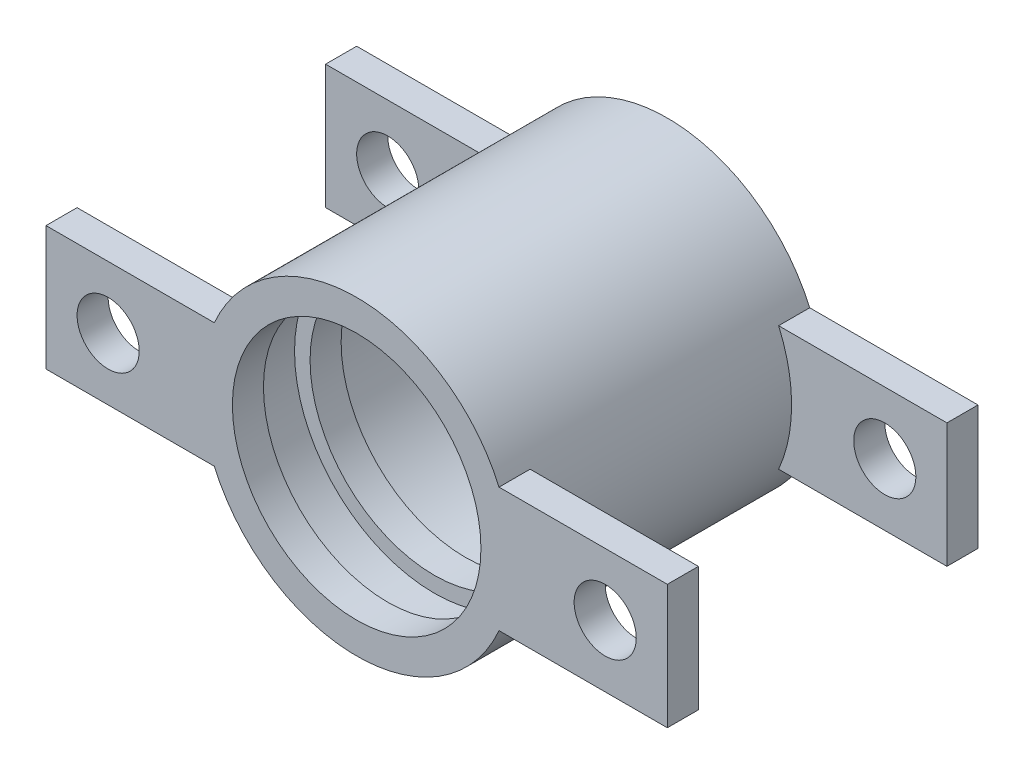
ISO-10303-21;
HEADER;
FILE_DESCRIPTION(('STEP AP214'),'2;1');
FILE_NAME('part.step','',(''),(''),'','','');
FILE_SCHEMA(('AUTOMOTIVE_DESIGN { 1 0 10303 214 1 1 1 1 }'));
ENDSEC;
DATA;
#1=APPLICATION_CONTEXT('core data for automotive mechanical design processes');
#2=APPLICATION_PROTOCOL_DEFINITION('international standard','automotive_design',2000,#1);
#3=PRODUCT_CONTEXT('',#1,'mechanical');
#4=PRODUCT('Part','Part','',(#3));
#5=PRODUCT_RELATED_PRODUCT_CATEGORY('part','',(#4));
#6=PRODUCT_DEFINITION_FORMATION('','',#4);
#7=PRODUCT_DEFINITION_CONTEXT('part definition',#1,'design');
#8=PRODUCT_DEFINITION('design','',#6,#7);
#9=PRODUCT_DEFINITION_SHAPE('','',#8);
#10=(LENGTH_UNIT() NAMED_UNIT(*) SI_UNIT(.MILLI.,.METRE.));
#11=(NAMED_UNIT(*) PLANE_ANGLE_UNIT() SI_UNIT($,.RADIAN.));
#12=(NAMED_UNIT(*) SI_UNIT($,.STERADIAN.) SOLID_ANGLE_UNIT());
#13=UNCERTAINTY_MEASURE_WITH_UNIT(LENGTH_MEASURE(1.E-05),#10,'distance_accuracy_value','');
#14=(GEOMETRIC_REPRESENTATION_CONTEXT(3) GLOBAL_UNCERTAINTY_ASSIGNED_CONTEXT((#13)) GLOBAL_UNIT_ASSIGNED_CONTEXT((#10,
#11,#12)) REPRESENTATION_CONTEXT('',''));
#15=CARTESIAN_POINT('',(0.,0.,0.));
#16=DIRECTION('',(0.,0.,1.));
#17=DIRECTION('',(1.,0.,0.));
#18=AXIS2_PLACEMENT_3D('',#15,#16,#17);
#19=CARTESIAN_POINT('',(0.,0.,-100.912408759124));
#20=DIRECTION('',(0.,0.,-1.));
#21=DIRECTION('',(-1.,0.,0.));
#22=AXIS2_PLACEMENT_3D('',#19,#20,#21);
#23=CYLINDRICAL_SURFACE('',#22,50.);
#24=DIRECTION('',(0.,0.,1.));
#25=VECTOR('',#24,1.);
#26=CARTESIAN_POINT('',(-45.8257569495584,20.,40.));
#27=LINE('',#26,#25);
#28=CARTESIAN_POINT('',(-45.8257569495584,20.,40.));
#29=VERTEX_POINT('',#28);
#30=CARTESIAN_POINT('',(-45.8257569495584,20.,50.));
#31=VERTEX_POINT('',#30);
#32=EDGE_CURVE('E269',#29,#31,#27,.T.);
#33=ORIENTED_EDGE('',*,*,#32,.T.);
#34=CARTESIAN_POINT('',(0.,0.,50.));
#35=DIRECTION('',(0.,0.,-1.));
#36=DIRECTION('',(-1.,0.,0.));
#37=AXIS2_PLACEMENT_3D('',#34,#35,#36);
#38=CIRCLE('',#37,50.);
#39=CARTESIAN_POINT('',(45.8257569495584,20.,50.));
#40=VERTEX_POINT('',#39);
#41=EDGE_CURVE('E386',#31,#40,#38,.T.);
#42=ORIENTED_EDGE('',*,*,#41,.T.);
#43=DIRECTION('',(0.,0.,1.));
#44=VECTOR('',#43,1.);
#45=CARTESIAN_POINT('',(45.8257569495584,20.,40.));
#46=LINE('',#45,#44);
#47=CARTESIAN_POINT('',(45.8257569495584,20.,40.));
#48=VERTEX_POINT('',#47);
#49=EDGE_CURVE('E326',#48,#40,#46,.T.);
#50=ORIENTED_EDGE('',*,*,#49,.F.);
#51=CARTESIAN_POINT('',(0.,0.,40.));
#52=DIRECTION('',(0.,0.,-1.));
#53=DIRECTION('',(1.,0.,0.));
#54=AXIS2_PLACEMENT_3D('',#51,#52,#53);
#55=CIRCLE('',#54,50.);
#56=CARTESIAN_POINT('',(45.8257569495584,-20.,40.));
#57=VERTEX_POINT('',#56);
#58=EDGE_CURVE('E300',#48,#57,#55,.T.);
#59=ORIENTED_EDGE('',*,*,#58,.T.);
#60=DIRECTION('',(0.,0.,1.));
#61=VECTOR('',#60,1.);
#62=CARTESIAN_POINT('',(45.8257569495584,-20.,40.));
#63=LINE('',#62,#61);
#64=CARTESIAN_POINT('',(45.8257569495584,-20.,50.));
#65=VERTEX_POINT('',#64);
#66=EDGE_CURVE('E322',#57,#65,#63,.T.);
#67=ORIENTED_EDGE('',*,*,#66,.T.);
#68=CARTESIAN_POINT('',(-45.8257569495584,-20.,50.));
#69=VERTEX_POINT('',#68);
#70=EDGE_CURVE('E387',#65,#69,#38,.T.);
#71=ORIENTED_EDGE('',*,*,#70,.T.);
#72=DIRECTION('',(0.,0.,1.));
#73=VECTOR('',#72,1.);
#74=CARTESIAN_POINT('',(-45.8257569495584,-20.,40.));
#75=LINE('',#74,#73);
#76=CARTESIAN_POINT('',(-45.8257569495584,-20.,40.));
#77=VERTEX_POINT('',#76);
#78=EDGE_CURVE('E274',#77,#69,#75,.T.);
#79=ORIENTED_EDGE('',*,*,#78,.F.);
#80=CARTESIAN_POINT('',(0.,0.,40.));
#81=DIRECTION('',(0.,0.,-1.));
#82=DIRECTION('',(1.,0.,0.));
#83=AXIS2_PLACEMENT_3D('',#80,#81,#82);
#84=CIRCLE('',#83,50.);
#85=EDGE_CURVE('E255',#77,#29,#84,.T.);
#86=ORIENTED_EDGE('',*,*,#85,.T.);
#87=EDGE_LOOP('',(#33,#42,#50,#59,#67,#71,#79,#86));
#88=FACE_BOUND('',#87,.T.);
#89=CARTESIAN_POINT('',(0.,0.,-50.));
#90=DIRECTION('',(0.,0.,-1.));
#91=DIRECTION('',(-1.,0.,0.));
#92=AXIS2_PLACEMENT_3D('',#89,#90,#91);
#93=CIRCLE('',#92,50.);
#94=CARTESIAN_POINT('',(-45.8257569495584,20.,-50.));
#95=VERTEX_POINT('',#94);
#96=CARTESIAN_POINT('',(45.8257569495584,20.,-50.));
#97=VERTEX_POINT('',#96);
#98=EDGE_CURVE('E49',#95,#97,#93,.T.);
#99=ORIENTED_EDGE('',*,*,#98,.F.);
#100=DIRECTION('',(0.,0.,-1.));
#101=VECTOR('',#100,1.);
#102=CARTESIAN_POINT('',(-45.8257569495584,20.,-40.));
#103=LINE('',#102,#101);
#104=CARTESIAN_POINT('',(-45.8257569495584,20.,-40.));
#105=VERTEX_POINT('',#104);
#106=EDGE_CURVE('E169',#105,#95,#103,.T.);
#107=ORIENTED_EDGE('',*,*,#106,.F.);
#108=CARTESIAN_POINT('',(0.,0.,-40.));
#109=DIRECTION('',(0.,0.,-1.));
#110=DIRECTION('',(1.,0.,0.));
#111=AXIS2_PLACEMENT_3D('',#108,#109,#110);
#112=CIRCLE('',#111,50.);
#113=CARTESIAN_POINT('',(-45.8257569495584,-20.,-40.));
#114=VERTEX_POINT('',#113);
#115=EDGE_CURVE('E153',#114,#105,#112,.T.);
#116=ORIENTED_EDGE('',*,*,#115,.F.);
#117=DIRECTION('',(0.,0.,-1.));
#118=VECTOR('',#117,1.);
#119=CARTESIAN_POINT('',(-45.8257569495584,-20.,-40.));
#120=LINE('',#119,#118);
#121=CARTESIAN_POINT('',(-45.8257569495584,-20.,-50.));
#122=VERTEX_POINT('',#121);
#123=EDGE_CURVE('E178',#114,#122,#120,.T.);
#124=ORIENTED_EDGE('',*,*,#123,.T.);
#125=CARTESIAN_POINT('',(45.8257569495584,-20.,-50.));
#126=VERTEX_POINT('',#125);
#127=EDGE_CURVE('E11',#126,#122,#93,.T.);
#128=ORIENTED_EDGE('',*,*,#127,.F.);
#129=DIRECTION('',(0.,0.,-1.));
#130=VECTOR('',#129,1.);
#131=CARTESIAN_POINT('',(45.8257569495584,-20.,-40.));
#132=LINE('',#131,#130);
#133=CARTESIAN_POINT('',(45.8257569495584,-20.,-40.));
#134=VERTEX_POINT('',#133);
#135=EDGE_CURVE('E228',#134,#126,#132,.T.);
#136=ORIENTED_EDGE('',*,*,#135,.F.);
#137=CARTESIAN_POINT('',(0.,0.,-40.));
#138=DIRECTION('',(0.,0.,-1.));
#139=DIRECTION('',(1.,0.,0.));
#140=AXIS2_PLACEMENT_3D('',#137,#138,#139);
#141=CIRCLE('',#140,50.);
#142=CARTESIAN_POINT('',(45.8257569495584,20.,-40.));
#143=VERTEX_POINT('',#142);
#144=EDGE_CURVE('E205',#143,#134,#141,.T.);
#145=ORIENTED_EDGE('',*,*,#144,.F.);
#146=DIRECTION('',(0.,0.,-1.));
#147=VECTOR('',#146,1.);
#148=CARTESIAN_POINT('',(45.8257569495584,20.,-40.));
#149=LINE('',#148,#147);
#150=EDGE_CURVE('E225',#143,#97,#149,.T.);
#151=ORIENTED_EDGE('',*,*,#150,.T.);
#152=EDGE_LOOP('',(#99,#107,#116,#124,#128,#136,#145,#151));
#153=FACE_BOUND('',#152,.T.);
#154=ADVANCED_FACE('F41',(#88,#153),#23,.T.);
#155=CARTESIAN_POINT('',(-45.,0.,50.));
#156=DIRECTION('',(0.,0.,1.));
#157=DIRECTION('',(1.,0.,0.));
#158=AXIS2_PLACEMENT_3D('',#155,#156,#157);
#159=PLANE('',#158);
#160=CARTESIAN_POINT('',(0.,0.,50.));
#161=DIRECTION('',(0.,0.,-1.));
#162=DIRECTION('',(-1.,0.,0.));
#163=AXIS2_PLACEMENT_3D('',#160,#161,#162);
#164=CIRCLE('',#163,40.);
#165=CARTESIAN_POINT('',(-40.,0.,50.));
#166=VERTEX_POINT('',#165);
#167=EDGE_CURVE('E383',#166,#166,#164,.T.);
#168=ORIENTED_EDGE('',*,*,#167,.T.);
#169=EDGE_LOOP('',(#168));
#170=FACE_BOUND('',#169,.T.);
#171=ORIENTED_EDGE('',*,*,#70,.F.);
#172=DIRECTION('',(1.,0.,0.));
#173=VECTOR('',#172,1.);
#174=CARTESIAN_POINT('',(45.8257569495584,-20.,50.));
#175=LINE('',#174,#173);
#176=CARTESIAN_POINT('',(100.,-20.,50.));
#177=VERTEX_POINT('',#176);
#178=EDGE_CURVE('E296',#65,#177,#175,.T.);
#179=ORIENTED_EDGE('',*,*,#178,.T.);
#180=DIRECTION('',(0.,1.,0.));
#181=VECTOR('',#180,1.);
#182=CARTESIAN_POINT('',(100.,20.,50.));
#183=LINE('',#182,#181);
#184=CARTESIAN_POINT('',(100.,20.,50.));
#185=VERTEX_POINT('',#184);
#186=EDGE_CURVE('E287',#177,#185,#183,.T.);
#187=ORIENTED_EDGE('',*,*,#186,.T.);
#188=DIRECTION('',(-1.,0.,0.));
#189=VECTOR('',#188,1.);
#190=CARTESIAN_POINT('',(45.8257569495584,20.,50.));
#191=LINE('',#190,#189);
#192=EDGE_CURVE('E311',#185,#40,#191,.T.);
#193=ORIENTED_EDGE('',*,*,#192,.T.);
#194=ORIENTED_EDGE('',*,*,#41,.F.);
#195=DIRECTION('',(-1.,0.,0.));
#196=VECTOR('',#195,1.);
#197=CARTESIAN_POINT('',(-45.8257569495584,20.,50.));
#198=LINE('',#197,#196);
#199=CARTESIAN_POINT('',(-100.,20.,50.));
#200=VERTEX_POINT('',#199);
#201=EDGE_CURVE('E238',#31,#200,#198,.T.);
#202=ORIENTED_EDGE('',*,*,#201,.T.);
#203=DIRECTION('',(0.,-1.,0.));
#204=VECTOR('',#203,1.);
#205=CARTESIAN_POINT('',(-100.,20.,50.));
#206=LINE('',#205,#204);
#207=CARTESIAN_POINT('',(-100.,-20.,50.));
#208=VERTEX_POINT('',#207);
#209=EDGE_CURVE('E262',#200,#208,#206,.T.);
#210=ORIENTED_EDGE('',*,*,#209,.T.);
#211=DIRECTION('',(1.,0.,0.));
#212=VECTOR('',#211,1.);
#213=CARTESIAN_POINT('',(-45.8257569495584,-20.,50.));
#214=LINE('',#213,#212);
#215=EDGE_CURVE('E247',#208,#69,#214,.T.);
#216=ORIENTED_EDGE('',*,*,#215,.T.);
#217=EDGE_LOOP('',(#171,#179,#187,#193,#194,#202,#210,#216));
#218=FACE_BOUND('',#217,.T.);
#219=CARTESIAN_POINT('',(80.,0.,50.));
#220=DIRECTION('',(0.,0.,1.));
#221=DIRECTION('',(1.,0.,0.));
#222=AXIS2_PLACEMENT_3D('',#219,#220,#221);
#223=CIRCLE('',#222,9.99999999999999);
#224=CARTESIAN_POINT('',(90.,0.,50.));
#225=VERTEX_POINT('',#224);
#226=EDGE_CURVE('E273',#225,#225,#223,.T.);
#227=ORIENTED_EDGE('',*,*,#226,.F.);
#228=EDGE_LOOP('',(#227));
#229=FACE_BOUND('',#228,.T.);
#230=CARTESIAN_POINT('',(-80.,0.,50.));
#231=DIRECTION('',(0.,0.,1.));
#232=DIRECTION('',(1.,0.,0.));
#233=AXIS2_PLACEMENT_3D('',#230,#231,#232);
#234=CIRCLE('',#233,9.99999999999999);
#235=CARTESIAN_POINT('',(-70.,0.,50.));
#236=VERTEX_POINT('',#235);
#237=EDGE_CURVE('E224',#236,#236,#234,.T.);
#238=ORIENTED_EDGE('',*,*,#237,.F.);
#239=EDGE_LOOP('',(#238));
#240=FACE_BOUND('',#239,.T.);
#241=ADVANCED_FACE('F400',(#170,#218,#229,#240),#159,.T.);
#242=CARTESIAN_POINT('',(0.,0.,-100.912408759124));
#243=DIRECTION('',(0.,0.,-1.));
#244=DIRECTION('',(-1.,0.,0.));
#245=AXIS2_PLACEMENT_3D('',#242,#243,#244);
#246=CYLINDRICAL_SURFACE('',#245,40.);
#247=CARTESIAN_POINT('',(0.,0.,40.));
#248=DIRECTION('',(0.,0.,-1.));
#249=DIRECTION('',(-1.,0.,0.));
#250=AXIS2_PLACEMENT_3D('',#247,#248,#249);
#251=CIRCLE('',#250,40.);
#252=CARTESIAN_POINT('',(-40.,0.,40.));
#253=VERTEX_POINT('',#252);
#254=EDGE_CURVE('E379',#253,#253,#251,.T.);
#255=ORIENTED_EDGE('',*,*,#254,.T.);
#256=EDGE_LOOP('',(#255));
#257=FACE_BOUND('',#256,.T.);
#258=ORIENTED_EDGE('',*,*,#167,.F.);
#259=EDGE_LOOP('',(#258));
#260=FACE_BOUND('',#259,.T.);
#261=ADVANCED_FACE('F427',(#257,#260),#246,.F.);
#262=CARTESIAN_POINT('',(-45.,0.,40.));
#263=DIRECTION('',(0.,0.,-1.));
#264=DIRECTION('',(-1.,0.,0.));
#265=AXIS2_PLACEMENT_3D('',#262,#263,#264);
#266=PLANE('',#265);
#267=CARTESIAN_POINT('',(0.,0.,40.));
#268=DIRECTION('',(0.,0.,-1.));
#269=DIRECTION('',(-1.,0.,0.));
#270=AXIS2_PLACEMENT_3D('',#267,#268,#269);
#271=CIRCLE('',#270,45.);
#272=CARTESIAN_POINT('',(-45.,0.,40.));
#273=VERTEX_POINT('',#272);
#274=EDGE_CURVE('E375',#273,#273,#271,.T.);
#275=ORIENTED_EDGE('',*,*,#274,.T.);
#276=EDGE_LOOP('',(#275));
#277=FACE_BOUND('',#276,.T.);
#278=ORIENTED_EDGE('',*,*,#254,.F.);
#279=EDGE_LOOP('',(#278));
#280=FACE_BOUND('',#279,.T.);
#281=ADVANCED_FACE('F432',(#277,#280),#266,.T.);
#282=CARTESIAN_POINT('',(0.,0.,-100.912408759124));
#283=DIRECTION('',(0.,0.,-1.));
#284=DIRECTION('',(-1.,0.,0.));
#285=AXIS2_PLACEMENT_3D('',#282,#283,#284);
#286=CYLINDRICAL_SURFACE('',#285,45.);
#287=CARTESIAN_POINT('',(0.,0.,25.));
#288=DIRECTION('',(0.,0.,-1.));
#289=DIRECTION('',(-1.,0.,0.));
#290=AXIS2_PLACEMENT_3D('',#287,#288,#289);
#291=CIRCLE('',#290,45.);
#292=CARTESIAN_POINT('',(-45.,0.,25.));
#293=VERTEX_POINT('',#292);
#294=EDGE_CURVE('E371',#293,#293,#291,.T.);
#295=ORIENTED_EDGE('',*,*,#294,.T.);
#296=EDGE_LOOP('',(#295));
#297=FACE_BOUND('',#296,.T.);
#298=ORIENTED_EDGE('',*,*,#274,.F.);
#299=EDGE_LOOP('',(#298));
#300=FACE_BOUND('',#299,.T.);
#301=ADVANCED_FACE('F438',(#297,#300),#286,.F.);
#302=CARTESIAN_POINT('',(-45.,0.,25.));
#303=DIRECTION('',(0.,0.,1.));
#304=DIRECTION('',(1.,0.,0.));
#305=AXIS2_PLACEMENT_3D('',#302,#303,#304);
#306=PLANE('',#305);
#307=CARTESIAN_POINT('',(0.,0.,25.));
#308=DIRECTION('',(0.,0.,-1.));
#309=DIRECTION('',(-1.,0.,0.));
#310=AXIS2_PLACEMENT_3D('',#307,#308,#309);
#311=CIRCLE('',#310,40.);
#312=CARTESIAN_POINT('',(-40.,0.,25.));
#313=VERTEX_POINT('',#312);
#314=EDGE_CURVE('E367',#313,#313,#311,.T.);
#315=ORIENTED_EDGE('',*,*,#314,.T.);
#316=EDGE_LOOP('',(#315));
#317=FACE_BOUND('',#316,.T.);
#318=ORIENTED_EDGE('',*,*,#294,.F.);
#319=EDGE_LOOP('',(#318));
#320=FACE_BOUND('',#319,.T.);
#321=ADVANCED_FACE('F442',(#317,#320),#306,.T.);
#322=CARTESIAN_POINT('',(0.,0.,-100.912408759124));
#323=DIRECTION('',(0.,0.,-1.));
#324=DIRECTION('',(-1.,0.,0.));
#325=AXIS2_PLACEMENT_3D('',#322,#323,#324);
#326=CYLINDRICAL_SURFACE('',#325,40.);
#327=CARTESIAN_POINT('',(0.,0.,15.));
#328=DIRECTION('',(0.,0.,-1.));
#329=DIRECTION('',(-1.,0.,0.));
#330=AXIS2_PLACEMENT_3D('',#327,#328,#329);
#331=CIRCLE('',#330,40.);
#332=CARTESIAN_POINT('',(-40.,0.,15.));
#333=VERTEX_POINT('',#332);
#334=EDGE_CURVE('E363',#333,#333,#331,.T.);
#335=ORIENTED_EDGE('',*,*,#334,.T.);
#336=EDGE_LOOP('',(#335));
#337=FACE_BOUND('',#336,.T.);
#338=ORIENTED_EDGE('',*,*,#314,.F.);
#339=EDGE_LOOP('',(#338));
#340=FACE_BOUND('',#339,.T.);
#341=ADVANCED_FACE('F446',(#337,#340),#326,.F.);
#342=CARTESIAN_POINT('',(-45.,0.,15.));
#343=DIRECTION('',(0.,0.,-1.));
#344=DIRECTION('',(-1.,0.,0.));
#345=AXIS2_PLACEMENT_3D('',#342,#343,#344);
#346=PLANE('',#345);
#347=CARTESIAN_POINT('',(0.,0.,15.));
#348=DIRECTION('',(0.,0.,-1.));
#349=DIRECTION('',(-1.,0.,0.));
#350=AXIS2_PLACEMENT_3D('',#347,#348,#349);
#351=CIRCLE('',#350,45.);
#352=CARTESIAN_POINT('',(-45.,0.,15.));
#353=VERTEX_POINT('',#352);
#354=EDGE_CURVE('E359',#353,#353,#351,.T.);
#355=ORIENTED_EDGE('',*,*,#354,.T.);
#356=EDGE_LOOP('',(#355));
#357=FACE_BOUND('',#356,.T.);
#358=ORIENTED_EDGE('',*,*,#334,.F.);
#359=EDGE_LOOP('',(#358));
#360=FACE_BOUND('',#359,.T.);
#361=ADVANCED_FACE('F450',(#357,#360),#346,.T.);
#362=CARTESIAN_POINT('',(0.,0.,-100.912408759124));
#363=DIRECTION('',(0.,0.,-1.));
#364=DIRECTION('',(-1.,0.,0.));
#365=AXIS2_PLACEMENT_3D('',#362,#363,#364);
#366=CYLINDRICAL_SURFACE('',#365,45.);
#367=CARTESIAN_POINT('',(0.,0.,-15.));
#368=DIRECTION('',(0.,0.,-1.));
#369=DIRECTION('',(-1.,0.,0.));
#370=AXIS2_PLACEMENT_3D('',#367,#368,#369);
#371=CIRCLE('',#370,45.);
#372=CARTESIAN_POINT('',(-45.,0.,-15.));
#373=VERTEX_POINT('',#372);
#374=EDGE_CURVE('E355',#373,#373,#371,.T.);
#375=ORIENTED_EDGE('',*,*,#374,.T.);
#376=EDGE_LOOP('',(#375));
#377=FACE_BOUND('',#376,.T.);
#378=ORIENTED_EDGE('',*,*,#354,.F.);
#379=EDGE_LOOP('',(#378));
#380=FACE_BOUND('',#379,.T.);
#381=ADVANCED_FACE('F454',(#377,#380),#366,.F.);
#382=CARTESIAN_POINT('',(-45.,0.,-15.));
#383=DIRECTION('',(0.,0.,1.));
#384=DIRECTION('',(1.,0.,0.));
#385=AXIS2_PLACEMENT_3D('',#382,#383,#384);
#386=PLANE('',#385);
#387=CARTESIAN_POINT('',(0.,0.,-15.));
#388=DIRECTION('',(0.,0.,-1.));
#389=DIRECTION('',(-1.,0.,0.));
#390=AXIS2_PLACEMENT_3D('',#387,#388,#389);
#391=CIRCLE('',#390,40.);
#392=CARTESIAN_POINT('',(-40.,0.,-15.));
#393=VERTEX_POINT('',#392);
#394=EDGE_CURVE('E351',#393,#393,#391,.T.);
#395=ORIENTED_EDGE('',*,*,#394,.T.);
#396=EDGE_LOOP('',(#395));
#397=FACE_BOUND('',#396,.T.);
#398=ORIENTED_EDGE('',*,*,#374,.F.);
#399=EDGE_LOOP('',(#398));
#400=FACE_BOUND('',#399,.T.);
#401=ADVANCED_FACE('F458',(#397,#400),#386,.T.);
#402=CARTESIAN_POINT('',(0.,0.,-100.912408759124));
#403=DIRECTION('',(0.,0.,-1.));
#404=DIRECTION('',(-1.,0.,0.));
#405=AXIS2_PLACEMENT_3D('',#402,#403,#404);
#406=CYLINDRICAL_SURFACE('',#405,40.);
#407=CARTESIAN_POINT('',(0.,0.,-25.));
#408=DIRECTION('',(0.,0.,-1.));
#409=DIRECTION('',(-1.,0.,0.));
#410=AXIS2_PLACEMENT_3D('',#407,#408,#409);
#411=CIRCLE('',#410,40.);
#412=CARTESIAN_POINT('',(-40.,0.,-25.));
#413=VERTEX_POINT('',#412);
#414=EDGE_CURVE('E347',#413,#413,#411,.T.);
#415=ORIENTED_EDGE('',*,*,#414,.T.);
#416=EDGE_LOOP('',(#415));
#417=FACE_BOUND('',#416,.T.);
#418=ORIENTED_EDGE('',*,*,#394,.F.);
#419=EDGE_LOOP('',(#418));
#420=FACE_BOUND('',#419,.T.);
#421=ADVANCED_FACE('F462',(#417,#420),#406,.F.);
#422=CARTESIAN_POINT('',(-45.,0.,-25.));
#423=DIRECTION('',(0.,0.,-1.));
#424=DIRECTION('',(-1.,0.,0.));
#425=AXIS2_PLACEMENT_3D('',#422,#423,#424);
#426=PLANE('',#425);
#427=CARTESIAN_POINT('',(0.,0.,-25.));
#428=DIRECTION('',(0.,0.,-1.));
#429=DIRECTION('',(-1.,0.,0.));
#430=AXIS2_PLACEMENT_3D('',#427,#428,#429);
#431=CIRCLE('',#430,45.);
#432=CARTESIAN_POINT('',(-45.,0.,-25.));
#433=VERTEX_POINT('',#432);
#434=EDGE_CURVE('E343',#433,#433,#431,.T.);
#435=ORIENTED_EDGE('',*,*,#434,.T.);
#436=EDGE_LOOP('',(#435));
#437=FACE_BOUND('',#436,.T.);
#438=ORIENTED_EDGE('',*,*,#414,.F.);
#439=EDGE_LOOP('',(#438));
#440=FACE_BOUND('',#439,.T.);
#441=ADVANCED_FACE('F466',(#437,#440),#426,.T.);
#442=CARTESIAN_POINT('',(0.,0.,-100.912408759124));
#443=DIRECTION('',(0.,0.,-1.));
#444=DIRECTION('',(-1.,0.,0.));
#445=AXIS2_PLACEMENT_3D('',#442,#443,#444);
#446=CYLINDRICAL_SURFACE('',#445,45.);
#447=CARTESIAN_POINT('',(0.,0.,-40.));
#448=DIRECTION('',(0.,0.,-1.));
#449=DIRECTION('',(-1.,0.,0.));
#450=AXIS2_PLACEMENT_3D('',#447,#448,#449);
#451=CIRCLE('',#450,45.);
#452=CARTESIAN_POINT('',(-45.,0.,-40.));
#453=VERTEX_POINT('',#452);
#454=EDGE_CURVE('E339',#453,#453,#451,.T.);
#455=ORIENTED_EDGE('',*,*,#454,.T.);
#456=EDGE_LOOP('',(#455));
#457=FACE_BOUND('',#456,.T.);
#458=ORIENTED_EDGE('',*,*,#434,.F.);
#459=EDGE_LOOP('',(#458));
#460=FACE_BOUND('',#459,.T.);
#461=ADVANCED_FACE('F470',(#457,#460),#446,.F.);
#462=CARTESIAN_POINT('',(-45.,0.,-40.));
#463=DIRECTION('',(0.,0.,1.));
#464=DIRECTION('',(1.,0.,0.));
#465=AXIS2_PLACEMENT_3D('',#462,#463,#464);
#466=PLANE('',#465);
#467=CARTESIAN_POINT('',(0.,0.,-40.));
#468=DIRECTION('',(0.,0.,-1.));
#469=DIRECTION('',(-1.,0.,0.));
#470=AXIS2_PLACEMENT_3D('',#467,#468,#469);
#471=CIRCLE('',#470,40.);
#472=CARTESIAN_POINT('',(-40.,0.,-40.));
#473=VERTEX_POINT('',#472);
#474=EDGE_CURVE('E335',#473,#473,#471,.T.);
#475=ORIENTED_EDGE('',*,*,#474,.T.);
#476=EDGE_LOOP('',(#475));
#477=FACE_BOUND('',#476,.T.);
#478=ORIENTED_EDGE('',*,*,#454,.F.);
#479=EDGE_LOOP('',(#478));
#480=FACE_BOUND('',#479,.T.);
#481=ADVANCED_FACE('F474',(#477,#480),#466,.T.);
#482=CARTESIAN_POINT('',(0.,0.,-100.912408759124));
#483=DIRECTION('',(0.,0.,-1.));
#484=DIRECTION('',(-1.,0.,0.));
#485=AXIS2_PLACEMENT_3D('',#482,#483,#484);
#486=CYLINDRICAL_SURFACE('',#485,40.);
#487=CARTESIAN_POINT('',(0.,0.,-50.));
#488=DIRECTION('',(0.,0.,-1.));
#489=DIRECTION('',(-1.,0.,0.));
#490=AXIS2_PLACEMENT_3D('',#487,#488,#489);
#491=CIRCLE('',#490,40.);
#492=CARTESIAN_POINT('',(-40.,0.,-50.));
#493=VERTEX_POINT('',#492);
#494=EDGE_CURVE('E321',#493,#493,#491,.T.);
#495=ORIENTED_EDGE('',*,*,#494,.T.);
#496=EDGE_LOOP('',(#495));
#497=FACE_BOUND('',#496,.T.);
#498=ORIENTED_EDGE('',*,*,#474,.F.);
#499=EDGE_LOOP('',(#498));
#500=FACE_BOUND('',#499,.T.);
#501=ADVANCED_FACE('F478',(#497,#500),#486,.F.);
#502=CARTESIAN_POINT('',(-45.,0.,-50.));
#503=DIRECTION('',(0.,0.,-1.));
#504=DIRECTION('',(-1.,0.,0.));
#505=AXIS2_PLACEMENT_3D('',#502,#503,#504);
#506=PLANE('',#505);
#507=ORIENTED_EDGE('',*,*,#127,.T.);
#508=DIRECTION('',(1.,0.,0.));
#509=VECTOR('',#508,1.);
#510=CARTESIAN_POINT('',(-45.8257569495584,-20.,-50.));
#511=LINE('',#510,#509);
#512=CARTESIAN_POINT('',(-100.,-20.,-50.));
#513=VERTEX_POINT('',#512);
#514=EDGE_CURVE('E508',#513,#122,#511,.T.);
#515=ORIENTED_EDGE('',*,*,#514,.F.);
#516=DIRECTION('',(0.,-1.,0.));
#517=VECTOR('',#516,1.);
#518=CARTESIAN_POINT('',(-100.,20.,-50.));
#519=LINE('',#518,#517);
#520=CARTESIAN_POINT('',(-100.,20.,-50.));
#521=VERTEX_POINT('',#520);
#522=EDGE_CURVE('E174',#521,#513,#519,.T.);
#523=ORIENTED_EDGE('',*,*,#522,.F.);
#524=DIRECTION('',(-1.,0.,0.));
#525=VECTOR('',#524,1.);
#526=CARTESIAN_POINT('',(-45.8257569495584,20.,-50.));
#527=LINE('',#526,#525);
#528=EDGE_CURVE('E56',#95,#521,#527,.T.);
#529=ORIENTED_EDGE('',*,*,#528,.F.);
#530=ORIENTED_EDGE('',*,*,#98,.T.);
#531=DIRECTION('',(-1.,0.,0.));
#532=VECTOR('',#531,1.);
#533=CARTESIAN_POINT('',(45.8257569495584,20.,-50.));
#534=LINE('',#533,#532);
#535=CARTESIAN_POINT('',(100.,20.,-50.));
#536=VERTEX_POINT('',#535);
#537=EDGE_CURVE('E202',#536,#97,#534,.T.);
#538=ORIENTED_EDGE('',*,*,#537,.F.);
#539=DIRECTION('',(0.,1.,0.));
#540=VECTOR('',#539,1.);
#541=CARTESIAN_POINT('',(100.,20.,-50.));
#542=LINE('',#541,#540);
#543=CARTESIAN_POINT('',(100.,-20.,-50.));
#544=VERTEX_POINT('',#543);
#545=EDGE_CURVE('E192',#544,#536,#542,.T.);
#546=ORIENTED_EDGE('',*,*,#545,.F.);
#547=DIRECTION('',(1.,0.,0.));
#548=VECTOR('',#547,1.);
#549=CARTESIAN_POINT('',(45.8257569495584,-20.,-50.));
#550=LINE('',#549,#548);
#551=EDGE_CURVE('E62',#126,#544,#550,.T.);
#552=ORIENTED_EDGE('',*,*,#551,.F.);
#553=EDGE_LOOP('',(#507,#515,#523,#529,#530,#538,#546,#552));
#554=FACE_BOUND('',#553,.T.);
#555=ORIENTED_EDGE('',*,*,#494,.F.);
#556=EDGE_LOOP('',(#555));
#557=FACE_BOUND('',#556,.T.);
#558=CARTESIAN_POINT('',(80.,0.,-50.));
#559=DIRECTION('',(0.,0.,1.));
#560=DIRECTION('',(1.,0.,0.));
#561=AXIS2_PLACEMENT_3D('',#558,#559,#560);
#562=CIRCLE('',#561,9.99999999999999);
#563=CARTESIAN_POINT('',(90.,0.,-50.));
#564=VERTEX_POINT('',#563);
#565=EDGE_CURVE('E193',#564,#564,#562,.T.);
#566=ORIENTED_EDGE('',*,*,#565,.T.);
#567=EDGE_LOOP('',(#566));
#568=FACE_BOUND('',#567,.T.);
#569=CARTESIAN_POINT('',(-80.,0.,-50.));
#570=DIRECTION('',(0.,0.,1.));
#571=DIRECTION('',(1.,0.,0.));
#572=AXIS2_PLACEMENT_3D('',#569,#570,#571);
#573=CIRCLE('',#572,9.99999999999999);
#574=CARTESIAN_POINT('',(-70.,0.,-50.));
#575=VERTEX_POINT('',#574);
#576=EDGE_CURVE('E495',#575,#575,#573,.T.);
#577=ORIENTED_EDGE('',*,*,#576,.T.);
#578=EDGE_LOOP('',(#577));
#579=FACE_BOUND('',#578,.T.);
#580=ADVANCED_FACE('F420',(#554,#557,#568,#579),#506,.T.);
#581=CARTESIAN_POINT('',(100.,20.,40.));
#582=DIRECTION('',(1.,0.,0.));
#583=DIRECTION('',(0.,0.,-1.));
#584=AXIS2_PLACEMENT_3D('',#581,#582,#583);
#585=PLANE('',#584);
#586=ORIENTED_EDGE('',*,*,#186,.F.);
#587=DIRECTION('',(0.,0.,1.));
#588=VECTOR('',#587,1.);
#589=CARTESIAN_POINT('',(100.,-20.,40.));
#590=LINE('',#589,#588);
#591=CARTESIAN_POINT('',(100.,-20.,40.));
#592=VERTEX_POINT('',#591);
#593=EDGE_CURVE('E318',#592,#177,#590,.T.);
#594=ORIENTED_EDGE('',*,*,#593,.F.);
#595=DIRECTION('',(0.,1.,0.));
#596=VECTOR('',#595,1.);
#597=CARTESIAN_POINT('',(100.,20.,40.));
#598=LINE('',#597,#596);
#599=CARTESIAN_POINT('',(100.,20.,40.));
#600=VERTEX_POINT('',#599);
#601=EDGE_CURVE('E291',#592,#600,#598,.T.);
#602=ORIENTED_EDGE('',*,*,#601,.T.);
#603=DIRECTION('',(0.,0.,1.));
#604=VECTOR('',#603,1.);
#605=CARTESIAN_POINT('',(100.,20.,40.));
#606=LINE('',#605,#604);
#607=EDGE_CURVE('E307',#600,#185,#606,.T.);
#608=ORIENTED_EDGE('',*,*,#607,.T.);
#609=EDGE_LOOP('',(#586,#594,#602,#608));
#610=FACE_BOUND('',#609,.T.);
#611=ADVANCED_FACE('F405',(#610),#585,.T.);
#612=CARTESIAN_POINT('',(45.8257569495584,-20.,40.));
#613=DIRECTION('',(0.,-1.,0.));
#614=DIRECTION('',(1.,0.,0.));
#615=AXIS2_PLACEMENT_3D('',#612,#613,#614);
#616=PLANE('',#615);
#617=ORIENTED_EDGE('',*,*,#178,.F.);
#618=ORIENTED_EDGE('',*,*,#66,.F.);
#619=DIRECTION('',(1.,0.,0.));
#620=VECTOR('',#619,1.);
#621=CARTESIAN_POINT('',(45.8257569495584,-20.,40.));
#622=LINE('',#621,#620);
#623=EDGE_CURVE('E303',#57,#592,#622,.T.);
#624=ORIENTED_EDGE('',*,*,#623,.T.);
#625=ORIENTED_EDGE('',*,*,#593,.T.);
#626=EDGE_LOOP('',(#617,#618,#624,#625));
#627=FACE_BOUND('',#626,.T.);
#628=ADVANCED_FACE('F412',(#627),#616,.T.);
#629=CARTESIAN_POINT('',(45.8257569495584,20.,40.));
#630=DIRECTION('',(0.,1.,0.));
#631=DIRECTION('',(-1.,0.,0.));
#632=AXIS2_PLACEMENT_3D('',#629,#630,#631);
#633=PLANE('',#632);
#634=ORIENTED_EDGE('',*,*,#192,.F.);
#635=ORIENTED_EDGE('',*,*,#607,.F.);
#636=DIRECTION('',(-1.,0.,0.));
#637=VECTOR('',#636,1.);
#638=CARTESIAN_POINT('',(45.8257569495584,20.,40.));
#639=LINE('',#638,#637);
#640=EDGE_CURVE('E295',#600,#48,#639,.T.);
#641=ORIENTED_EDGE('',*,*,#640,.T.);
#642=ORIENTED_EDGE('',*,*,#49,.T.);
#643=EDGE_LOOP('',(#634,#635,#641,#642));
#644=FACE_BOUND('',#643,.T.);
#645=ADVANCED_FACE('F398',(#644),#633,.T.);
#646=CARTESIAN_POINT('',(0.,0.,40.));
#647=DIRECTION('',(0.,0.,1.));
#648=DIRECTION('',(1.,0.,0.));
#649=AXIS2_PLACEMENT_3D('',#646,#647,#648);
#650=PLANE('',#649);
#651=CARTESIAN_POINT('',(80.,0.,40.));
#652=DIRECTION('',(0.,0.,1.));
#653=DIRECTION('',(1.,0.,0.));
#654=AXIS2_PLACEMENT_3D('',#651,#652,#653);
#655=CIRCLE('',#654,9.99999999999999);
#656=CARTESIAN_POINT('',(90.,0.,40.));
#657=VERTEX_POINT('',#656);
#658=EDGE_CURVE('E283',#657,#657,#655,.T.);
#659=ORIENTED_EDGE('',*,*,#658,.T.);
#660=EDGE_LOOP('',(#659));
#661=FACE_BOUND('',#660,.T.);
#662=ORIENTED_EDGE('',*,*,#601,.F.);
#663=ORIENTED_EDGE('',*,*,#623,.F.);
#664=ORIENTED_EDGE('',*,*,#58,.F.);
#665=ORIENTED_EDGE('',*,*,#640,.F.);
#666=EDGE_LOOP('',(#662,#663,#664,#665));
#667=FACE_BOUND('',#666,.T.);
#668=ADVANCED_FACE('F408',(#661,#667),#650,.F.);
#669=CARTESIAN_POINT('',(80.,0.,40.));
#670=DIRECTION('',(0.,0.,1.));
#671=DIRECTION('',(1.,0.,0.));
#672=AXIS2_PLACEMENT_3D('',#669,#670,#671);
#673=CYLINDRICAL_SURFACE('',#672,9.99999999999999);
#674=ORIENTED_EDGE('',*,*,#658,.F.);
#675=EDGE_LOOP('',(#674));
#676=FACE_BOUND('',#675,.T.);
#677=ORIENTED_EDGE('',*,*,#226,.T.);
#678=EDGE_LOOP('',(#677));
#679=FACE_BOUND('',#678,.T.);
#680=ADVANCED_FACE('F572',(#676,#679),#673,.F.);
#681=CARTESIAN_POINT('',(-45.8257569495584,20.,40.));
#682=DIRECTION('',(0.,1.,0.));
#683=DIRECTION('',(-1.,0.,0.));
#684=AXIS2_PLACEMENT_3D('',#681,#682,#683);
#685=PLANE('',#684);
#686=ORIENTED_EDGE('',*,*,#201,.F.);
#687=ORIENTED_EDGE('',*,*,#32,.F.);
#688=DIRECTION('',(-1.,0.,0.));
#689=VECTOR('',#688,1.);
#690=CARTESIAN_POINT('',(-45.8257569495584,20.,40.));
#691=LINE('',#690,#689);
#692=CARTESIAN_POINT('',(-100.,20.,40.));
#693=VERTEX_POINT('',#692);
#694=EDGE_CURVE('E242',#29,#693,#691,.T.);
#695=ORIENTED_EDGE('',*,*,#694,.T.);
#696=DIRECTION('',(0.,0.,1.));
#697=VECTOR('',#696,1.);
#698=CARTESIAN_POINT('',(-100.,20.,40.));
#699=LINE('',#698,#697);
#700=EDGE_CURVE('E258',#693,#200,#699,.T.);
#701=ORIENTED_EDGE('',*,*,#700,.T.);
#702=EDGE_LOOP('',(#686,#687,#695,#701));
#703=FACE_BOUND('',#702,.T.);
#704=ADVANCED_FACE('F565',(#703),#685,.T.);
#705=CARTESIAN_POINT('',(-45.8257569495584,-20.,40.));
#706=DIRECTION('',(0.,-1.,0.));
#707=DIRECTION('',(1.,0.,0.));
#708=AXIS2_PLACEMENT_3D('',#705,#706,#707);
#709=PLANE('',#708);
#710=ORIENTED_EDGE('',*,*,#215,.F.);
#711=DIRECTION('',(0.,0.,1.));
#712=VECTOR('',#711,1.);
#713=CARTESIAN_POINT('',(-100.,-20.,40.));
#714=LINE('',#713,#712);
#715=CARTESIAN_POINT('',(-100.,-20.,40.));
#716=VERTEX_POINT('',#715);
#717=EDGE_CURVE('E278',#716,#208,#714,.T.);
#718=ORIENTED_EDGE('',*,*,#717,.F.);
#719=DIRECTION('',(1.,0.,0.));
#720=VECTOR('',#719,1.);
#721=CARTESIAN_POINT('',(-45.8257569495584,-20.,40.));
#722=LINE('',#721,#720);
#723=EDGE_CURVE('E251',#716,#77,#722,.T.);
#724=ORIENTED_EDGE('',*,*,#723,.T.);
#725=ORIENTED_EDGE('',*,*,#78,.T.);
#726=EDGE_LOOP('',(#710,#718,#724,#725));
#727=FACE_BOUND('',#726,.T.);
#728=ADVANCED_FACE('F562',(#727),#709,.T.);
#729=CARTESIAN_POINT('',(-100.,20.,40.));
#730=DIRECTION('',(-1.,0.,0.));
#731=DIRECTION('',(0.,0.,1.));
#732=AXIS2_PLACEMENT_3D('',#729,#730,#731);
#733=PLANE('',#732);
#734=ORIENTED_EDGE('',*,*,#209,.F.);
#735=ORIENTED_EDGE('',*,*,#700,.F.);
#736=DIRECTION('',(0.,-1.,0.));
#737=VECTOR('',#736,1.);
#738=CARTESIAN_POINT('',(-100.,20.,40.));
#739=LINE('',#738,#737);
#740=EDGE_CURVE('E246',#693,#716,#739,.T.);
#741=ORIENTED_EDGE('',*,*,#740,.T.);
#742=ORIENTED_EDGE('',*,*,#717,.T.);
#743=EDGE_LOOP('',(#734,#735,#741,#742));
#744=FACE_BOUND('',#743,.T.);
#745=ADVANCED_FACE('F560',(#744),#733,.T.);
#746=CARTESIAN_POINT('',(0.,0.,40.));
#747=DIRECTION('',(0.,0.,1.));
#748=DIRECTION('',(1.,0.,0.));
#749=AXIS2_PLACEMENT_3D('',#746,#747,#748);
#750=PLANE('',#749);
#751=CARTESIAN_POINT('',(-80.,0.,40.));
#752=DIRECTION('',(0.,0.,1.));
#753=DIRECTION('',(1.,0.,0.));
#754=AXIS2_PLACEMENT_3D('',#751,#752,#753);
#755=CIRCLE('',#754,9.99999999999999);
#756=CARTESIAN_POINT('',(-70.,0.,40.));
#757=VERTEX_POINT('',#756);
#758=EDGE_CURVE('E234',#757,#757,#755,.T.);
#759=ORIENTED_EDGE('',*,*,#758,.T.);
#760=EDGE_LOOP('',(#759));
#761=FACE_BOUND('',#760,.T.);
#762=ORIENTED_EDGE('',*,*,#694,.F.);
#763=ORIENTED_EDGE('',*,*,#85,.F.);
#764=ORIENTED_EDGE('',*,*,#723,.F.);
#765=ORIENTED_EDGE('',*,*,#740,.F.);
#766=EDGE_LOOP('',(#762,#763,#764,#765));
#767=FACE_BOUND('',#766,.T.);
#768=ADVANCED_FACE('F556',(#761,#767),#750,.F.);
#769=CARTESIAN_POINT('',(-80.,0.,40.));
#770=DIRECTION('',(0.,0.,1.));
#771=DIRECTION('',(1.,0.,0.));
#772=AXIS2_PLACEMENT_3D('',#769,#770,#771);
#773=CYLINDRICAL_SURFACE('',#772,9.99999999999999);
#774=ORIENTED_EDGE('',*,*,#758,.F.);
#775=EDGE_LOOP('',(#774));
#776=FACE_BOUND('',#775,.T.);
#777=ORIENTED_EDGE('',*,*,#237,.T.);
#778=EDGE_LOOP('',(#777));
#779=FACE_BOUND('',#778,.T.);
#780=ADVANCED_FACE('F542',(#776,#779),#773,.F.);
#781=CARTESIAN_POINT('',(0.,0.,-40.));
#782=DIRECTION('',(0.,0.,-1.));
#783=DIRECTION('',(1.,0.,0.));
#784=AXIS2_PLACEMENT_3D('',#781,#782,#783);
#785=PLANE('',#784);
#786=DIRECTION('',(0.,1.,0.));
#787=VECTOR('',#786,1.);
#788=CARTESIAN_POINT('',(100.,20.,-40.));
#789=LINE('',#788,#787);
#790=CARTESIAN_POINT('',(100.,-20.,-40.));
#791=VERTEX_POINT('',#790);
#792=CARTESIAN_POINT('',(100.,20.,-40.));
#793=VERTEX_POINT('',#792);
#794=EDGE_CURVE('E197',#791,#793,#789,.T.);
#795=ORIENTED_EDGE('',*,*,#794,.T.);
#796=DIRECTION('',(-1.,0.,0.));
#797=VECTOR('',#796,1.);
#798=CARTESIAN_POINT('',(45.8257569495584,20.,-40.));
#799=LINE('',#798,#797);
#800=EDGE_CURVE('E208',#793,#143,#799,.T.);
#801=ORIENTED_EDGE('',*,*,#800,.T.);
#802=ORIENTED_EDGE('',*,*,#144,.T.);
#803=DIRECTION('',(1.,0.,0.));
#804=VECTOR('',#803,1.);
#805=CARTESIAN_POINT('',(45.8257569495584,-20.,-40.));
#806=LINE('',#805,#804);
#807=EDGE_CURVE('E201',#134,#791,#806,.T.);
#808=ORIENTED_EDGE('',*,*,#807,.T.);
#809=EDGE_LOOP('',(#795,#801,#802,#808));
#810=FACE_BOUND('',#809,.T.);
#811=CARTESIAN_POINT('',(80.,0.,-40.));
#812=DIRECTION('',(0.,0.,1.));
#813=DIRECTION('',(1.,0.,0.));
#814=AXIS2_PLACEMENT_3D('',#811,#812,#813);
#815=CIRCLE('',#814,9.99999999999999);
#816=CARTESIAN_POINT('',(90.,0.,-40.));
#817=VERTEX_POINT('',#816);
#818=EDGE_CURVE('E188',#817,#817,#815,.T.);
#819=ORIENTED_EDGE('',*,*,#818,.F.);
#820=EDGE_LOOP('',(#819));
#821=FACE_BOUND('',#820,.T.);
#822=ADVANCED_FACE('F538',(#810,#821),#785,.F.);
#823=CARTESIAN_POINT('',(100.,20.,-40.));
#824=DIRECTION('',(-1.,0.,0.));
#825=DIRECTION('',(0.,0.,1.));
#826=AXIS2_PLACEMENT_3D('',#823,#824,#825);
#827=PLANE('',#826);
#828=ORIENTED_EDGE('',*,*,#545,.T.);
#829=DIRECTION('',(0.,0.,-1.));
#830=VECTOR('',#829,1.);
#831=CARTESIAN_POINT('',(100.,20.,-40.));
#832=LINE('',#831,#830);
#833=EDGE_CURVE('E220',#793,#536,#832,.T.);
#834=ORIENTED_EDGE('',*,*,#833,.F.);
#835=ORIENTED_EDGE('',*,*,#794,.F.);
#836=DIRECTION('',(0.,0.,-1.));
#837=VECTOR('',#836,1.);
#838=CARTESIAN_POINT('',(100.,-20.,-40.));
#839=LINE('',#838,#837);
#840=EDGE_CURVE('E211',#791,#544,#839,.T.);
#841=ORIENTED_EDGE('',*,*,#840,.T.);
#842=EDGE_LOOP('',(#828,#834,#835,#841));
#843=FACE_BOUND('',#842,.T.);
#844=ADVANCED_FACE('F541',(#843),#827,.F.);
#845=CARTESIAN_POINT('',(45.8257569495584,20.,-40.));
#846=DIRECTION('',(0.,-1.,0.));
#847=DIRECTION('',(1.,0.,0.));
#848=AXIS2_PLACEMENT_3D('',#845,#846,#847);
#849=PLANE('',#848);
#850=ORIENTED_EDGE('',*,*,#537,.T.);
#851=ORIENTED_EDGE('',*,*,#150,.F.);
#852=ORIENTED_EDGE('',*,*,#800,.F.);
#853=ORIENTED_EDGE('',*,*,#833,.T.);
#854=EDGE_LOOP('',(#850,#851,#852,#853));
#855=FACE_BOUND('',#854,.T.);
#856=ADVANCED_FACE('F544',(#855),#849,.F.);
#857=CARTESIAN_POINT('',(45.8257569495584,-20.,-40.));
#858=DIRECTION('',(0.,1.,0.));
#859=DIRECTION('',(-1.,0.,0.));
#860=AXIS2_PLACEMENT_3D('',#857,#858,#859);
#861=PLANE('',#860);
#862=ORIENTED_EDGE('',*,*,#551,.T.);
#863=ORIENTED_EDGE('',*,*,#840,.F.);
#864=ORIENTED_EDGE('',*,*,#807,.F.);
#865=ORIENTED_EDGE('',*,*,#135,.T.);
#866=EDGE_LOOP('',(#862,#863,#864,#865));
#867=FACE_BOUND('',#866,.T.);
#868=ADVANCED_FACE('F536',(#867),#861,.F.);
#869=CARTESIAN_POINT('',(80.,0.,-40.));
#870=DIRECTION('',(0.,0.,-1.));
#871=DIRECTION('',(-1.,0.,0.));
#872=AXIS2_PLACEMENT_3D('',#869,#870,#871);
#873=CYLINDRICAL_SURFACE('',#872,9.99999999999999);
#874=ORIENTED_EDGE('',*,*,#818,.T.);
#875=EDGE_LOOP('',(#874));
#876=FACE_BOUND('',#875,.T.);
#877=ORIENTED_EDGE('',*,*,#565,.F.);
#878=EDGE_LOOP('',(#877));
#879=FACE_BOUND('',#878,.T.);
#880=ADVANCED_FACE('F533',(#876,#879),#873,.F.);
#881=CARTESIAN_POINT('',(0.,0.,-40.));
#882=DIRECTION('',(0.,0.,-1.));
#883=DIRECTION('',(1.,0.,0.));
#884=AXIS2_PLACEMENT_3D('',#881,#882,#883);
#885=PLANE('',#884);
#886=DIRECTION('',(-1.,0.,0.));
#887=VECTOR('',#886,1.);
#888=CARTESIAN_POINT('',(-45.8257569495584,20.,-40.));
#889=LINE('',#888,#887);
#890=CARTESIAN_POINT('',(-100.,20.,-40.));
#891=VERTEX_POINT('',#890);
#892=EDGE_CURVE('E157',#105,#891,#889,.T.);
#893=ORIENTED_EDGE('',*,*,#892,.T.);
#894=DIRECTION('',(0.,-1.,0.));
#895=VECTOR('',#894,1.);
#896=CARTESIAN_POINT('',(-100.,20.,-40.));
#897=LINE('',#896,#895);
#898=CARTESIAN_POINT('',(-100.,-20.,-40.));
#899=VERTEX_POINT('',#898);
#900=EDGE_CURVE('E179',#891,#899,#897,.T.);
#901=ORIENTED_EDGE('',*,*,#900,.T.);
#902=DIRECTION('',(1.,0.,0.));
#903=VECTOR('',#902,1.);
#904=CARTESIAN_POINT('',(-45.8257569495584,-20.,-40.));
#905=LINE('',#904,#903);
#906=EDGE_CURVE('E160',#899,#114,#905,.T.);
#907=ORIENTED_EDGE('',*,*,#906,.T.);
#908=ORIENTED_EDGE('',*,*,#115,.T.);
#909=EDGE_LOOP('',(#893,#901,#907,#908));
#910=FACE_BOUND('',#909,.T.);
#911=CARTESIAN_POINT('',(-80.,0.,-40.));
#912=DIRECTION('',(0.,0.,1.));
#913=DIRECTION('',(1.,0.,0.));
#914=AXIS2_PLACEMENT_3D('',#911,#912,#913);
#915=CIRCLE('',#914,9.99999999999999);
#916=CARTESIAN_POINT('',(-70.,0.,-40.));
#917=VERTEX_POINT('',#916);
#918=EDGE_CURVE('E498',#917,#917,#915,.T.);
#919=ORIENTED_EDGE('',*,*,#918,.F.);
#920=EDGE_LOOP('',(#919));
#921=FACE_BOUND('',#920,.T.);
#922=ADVANCED_FACE('F155',(#910,#921),#885,.F.);
#923=CARTESIAN_POINT('',(-45.8257569495584,20.,-40.));
#924=DIRECTION('',(0.,-1.,0.));
#925=DIRECTION('',(1.,0.,0.));
#926=AXIS2_PLACEMENT_3D('',#923,#924,#925);
#927=PLANE('',#926);
#928=ORIENTED_EDGE('',*,*,#528,.T.);
#929=DIRECTION('',(0.,0.,-1.));
#930=VECTOR('',#929,1.);
#931=CARTESIAN_POINT('',(-100.,20.,-40.));
#932=LINE('',#931,#930);
#933=EDGE_CURVE('E172',#891,#521,#932,.T.);
#934=ORIENTED_EDGE('',*,*,#933,.F.);
#935=ORIENTED_EDGE('',*,*,#892,.F.);
#936=ORIENTED_EDGE('',*,*,#106,.T.);
#937=EDGE_LOOP('',(#928,#934,#935,#936));
#938=FACE_BOUND('',#937,.T.);
#939=ADVANCED_FACE('F168',(#938),#927,.F.);
#940=CARTESIAN_POINT('',(-100.,20.,-40.));
#941=DIRECTION('',(1.,0.,0.));
#942=DIRECTION('',(0.,0.,-1.));
#943=AXIS2_PLACEMENT_3D('',#940,#941,#942);
#944=PLANE('',#943);
#945=ORIENTED_EDGE('',*,*,#522,.T.);
#946=DIRECTION('',(0.,0.,-1.));
#947=VECTOR('',#946,1.);
#948=CARTESIAN_POINT('',(-100.,-20.,-40.));
#949=LINE('',#948,#947);
#950=EDGE_CURVE('E183',#899,#513,#949,.T.);
#951=ORIENTED_EDGE('',*,*,#950,.F.);
#952=ORIENTED_EDGE('',*,*,#900,.F.);
#953=ORIENTED_EDGE('',*,*,#933,.T.);
#954=EDGE_LOOP('',(#945,#951,#952,#953));
#955=FACE_BOUND('',#954,.T.);
#956=ADVANCED_FACE('F520',(#955),#944,.F.);
#957=CARTESIAN_POINT('',(-45.8257569495584,-20.,-40.));
#958=DIRECTION('',(0.,1.,0.));
#959=DIRECTION('',(-1.,0.,0.));
#960=AXIS2_PLACEMENT_3D('',#957,#958,#959);
#961=PLANE('',#960);
#962=ORIENTED_EDGE('',*,*,#514,.T.);
#963=ORIENTED_EDGE('',*,*,#123,.F.);
#964=ORIENTED_EDGE('',*,*,#906,.F.);
#965=ORIENTED_EDGE('',*,*,#950,.T.);
#966=EDGE_LOOP('',(#962,#963,#964,#965));
#967=FACE_BOUND('',#966,.T.);
#968=ADVANCED_FACE('F518',(#967),#961,.F.);
#969=CARTESIAN_POINT('',(-80.,0.,-40.));
#970=DIRECTION('',(0.,0.,-1.));
#971=DIRECTION('',(-1.,0.,0.));
#972=AXIS2_PLACEMENT_3D('',#969,#970,#971);
#973=CYLINDRICAL_SURFACE('',#972,9.99999999999999);
#974=ORIENTED_EDGE('',*,*,#918,.T.);
#975=EDGE_LOOP('',(#974));
#976=FACE_BOUND('',#975,.T.);
#977=ORIENTED_EDGE('',*,*,#576,.F.);
#978=EDGE_LOOP('',(#977));
#979=FACE_BOUND('',#978,.T.);
#980=ADVANCED_FACE('F527',(#976,#979),#973,.F.);
#981=CLOSED_SHELL('',(#154,#241,#261,#281,#301,#321,#341,#361,#381,#401,#421,#441,#461,#481,
#501,#580,#611,#628,#645,#668,#680,#704,#728,#745,#768,#780,#822,#844,#856,#868,#880,#922,#939,
#956,#968,#980));
#982=MANIFOLD_SOLID_BREP('B2',#981);
#983=ADVANCED_BREP_SHAPE_REPRESENTATION('',(#18,#982),#14);
#984=SHAPE_DEFINITION_REPRESENTATION(#9,#983);
ENDSEC;
END-ISO-10303-21;
